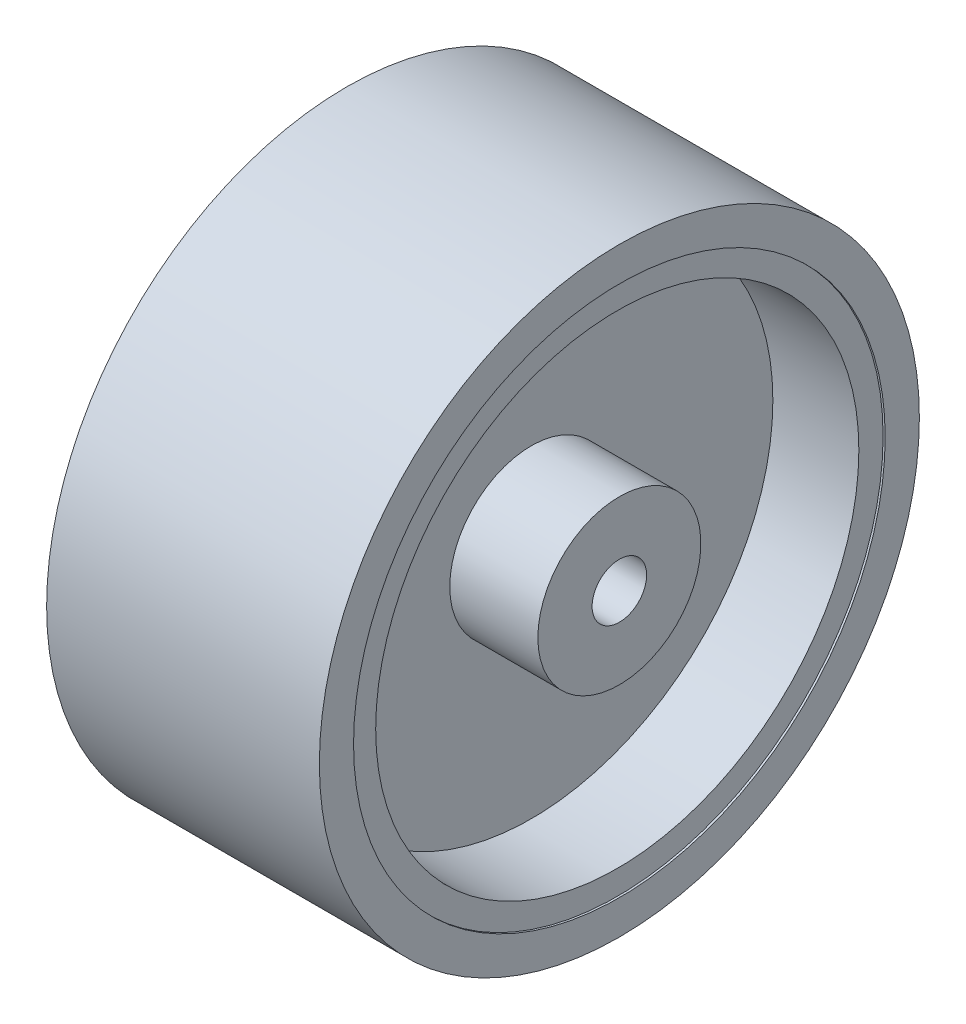
ISO-10303-21;
HEADER;
FILE_DESCRIPTION(('STEP AP214'),'2;1');
FILE_NAME('part.step','',(''),(''),'','','');
FILE_SCHEMA(('AUTOMOTIVE_DESIGN { 1 0 10303 214 1 1 1 1 }'));
ENDSEC;
DATA;
#1=APPLICATION_CONTEXT('core data for automotive mechanical design processes');
#2=APPLICATION_PROTOCOL_DEFINITION('international standard','automotive_design',2000,#1);
#3=PRODUCT_CONTEXT('',#1,'mechanical');
#4=PRODUCT('Part','Part','',(#3));
#5=PRODUCT_RELATED_PRODUCT_CATEGORY('part','',(#4));
#6=PRODUCT_DEFINITION_FORMATION('','',#4);
#7=PRODUCT_DEFINITION_CONTEXT('part definition',#1,'design');
#8=PRODUCT_DEFINITION('design','',#6,#7);
#9=PRODUCT_DEFINITION_SHAPE('','',#8);
#10=(LENGTH_UNIT() NAMED_UNIT(*) SI_UNIT(.MILLI.,.METRE.));
#11=(NAMED_UNIT(*) PLANE_ANGLE_UNIT() SI_UNIT($,.RADIAN.));
#12=(NAMED_UNIT(*) SI_UNIT($,.STERADIAN.) SOLID_ANGLE_UNIT());
#13=UNCERTAINTY_MEASURE_WITH_UNIT(LENGTH_MEASURE(1.E-05),#10,'distance_accuracy_value','');
#14=(GEOMETRIC_REPRESENTATION_CONTEXT(3) GLOBAL_UNCERTAINTY_ASSIGNED_CONTEXT((#13)) GLOBAL_UNIT_ASSIGNED_CONTEXT((#10,
#11,#12)) REPRESENTATION_CONTEXT('',''));
#15=CARTESIAN_POINT('',(0.,0.,0.));
#16=DIRECTION('',(0.,0.,1.));
#17=DIRECTION('',(1.,0.,0.));
#18=AXIS2_PLACEMENT_3D('',#15,#16,#17);
#19=CARTESIAN_POINT('',(-44.6044873702833,0.,0.));
#20=DIRECTION('',(-1.,0.,0.));
#21=DIRECTION('',(0.,0.,1.));
#22=AXIS2_PLACEMENT_3D('',#19,#20,#21);
#23=CYLINDRICAL_SURFACE('',#22,2.49999999999999);
#24=CARTESIAN_POINT('',(12.5,0.,0.));
#25=DIRECTION('',(-1.,0.,0.));
#26=DIRECTION('',(0.,0.,1.));
#27=AXIS2_PLACEMENT_3D('',#24,#25,#26);
#28=CIRCLE('',#27,2.49999999999999);
#29=CARTESIAN_POINT('',(12.5,0.,2.49999999999999));
#30=VERTEX_POINT('',#29);
#31=EDGE_CURVE('E85',#30,#30,#28,.T.);
#32=ORIENTED_EDGE('',*,*,#31,.F.);
#33=EDGE_LOOP('',(#32));
#34=FACE_BOUND('',#33,.T.);
#35=CARTESIAN_POINT('',(-12.5,0.,0.));
#36=DIRECTION('',(-1.,0.,0.));
#37=DIRECTION('',(0.,0.,1.));
#38=AXIS2_PLACEMENT_3D('',#35,#36,#37);
#39=CIRCLE('',#38,2.49999999999999);
#40=CARTESIAN_POINT('',(-12.5,0.,2.49999999999999));
#41=VERTEX_POINT('',#40);
#42=EDGE_CURVE('E10',#41,#41,#39,.T.);
#43=ORIENTED_EDGE('',*,*,#42,.T.);
#44=EDGE_LOOP('',(#43));
#45=FACE_BOUND('',#44,.T.);
#46=ADVANCED_FACE('F33',(#34,#45),#23,.F.);
#47=CARTESIAN_POINT('',(-12.5,7.47149617375056,0.));
#48=DIRECTION('',(1.,0.,0.));
#49=DIRECTION('',(0.,0.,-1.));
#50=AXIS2_PLACEMENT_3D('',#47,#48,#49);
#51=PLANE('',#50);
#52=ORIENTED_EDGE('',*,*,#42,.F.);
#53=EDGE_LOOP('',(#52));
#54=FACE_BOUND('',#53,.T.);
#55=CARTESIAN_POINT('',(-12.5,0.,0.));
#56=DIRECTION('',(-1.,0.,0.));
#57=DIRECTION('',(0.,0.,1.));
#58=AXIS2_PLACEMENT_3D('',#55,#56,#57);
#59=CIRCLE('',#58,7.47149617375057);
#60=CARTESIAN_POINT('',(-12.5,0.,7.47149617375057));
#61=VERTEX_POINT('',#60);
#62=EDGE_CURVE('E39',#61,#61,#59,.T.);
#63=ORIENTED_EDGE('',*,*,#62,.T.);
#64=EDGE_LOOP('',(#63));
#65=FACE_BOUND('',#64,.T.);
#66=ADVANCED_FACE('F92',(#54,#65),#51,.F.);
#67=CARTESIAN_POINT('',(-44.6044873702833,0.,0.));
#68=DIRECTION('',(-1.,0.,0.));
#69=DIRECTION('',(0.,0.,1.));
#70=AXIS2_PLACEMENT_3D('',#67,#68,#69);
#71=CYLINDRICAL_SURFACE('',#70,7.47149617375057);
#72=ORIENTED_EDGE('',*,*,#62,.F.);
#73=EDGE_LOOP('',(#72));
#74=FACE_BOUND('',#73,.T.);
#75=CARTESIAN_POINT('',(-4.42564817527247,0.,0.));
#76=DIRECTION('',(-1.,0.,0.));
#77=DIRECTION('',(0.,0.,1.));
#78=AXIS2_PLACEMENT_3D('',#75,#76,#77);
#79=CIRCLE('',#78,7.47149617375057);
#80=CARTESIAN_POINT('',(-4.42564817527247,0.,7.47149617375057));
#81=VERTEX_POINT('',#80);
#82=EDGE_CURVE('E43',#81,#81,#79,.T.);
#83=ORIENTED_EDGE('',*,*,#82,.T.);
#84=EDGE_LOOP('',(#83));
#85=FACE_BOUND('',#84,.T.);
#86=ADVANCED_FACE('F96',(#74,#85),#71,.T.);
#87=CARTESIAN_POINT('',(-4.42564817527247,22.1448012654798,0.));
#88=DIRECTION('',(1.,0.,0.));
#89=DIRECTION('',(0.,0.,-1.));
#90=AXIS2_PLACEMENT_3D('',#87,#88,#89);
#91=PLANE('',#90);
#92=ORIENTED_EDGE('',*,*,#82,.F.);
#93=EDGE_LOOP('',(#92));
#94=FACE_BOUND('',#93,.T.);
#95=CARTESIAN_POINT('',(-4.42564817527247,0.,0.));
#96=DIRECTION('',(-1.,0.,0.));
#97=DIRECTION('',(0.,0.,1.));
#98=AXIS2_PLACEMENT_3D('',#95,#96,#97);
#99=CIRCLE('',#98,22.1448012654799);
#100=CARTESIAN_POINT('',(-4.42564817527247,0.,22.1448012654799));
#101=VERTEX_POINT('',#100);
#102=EDGE_CURVE('E47',#101,#101,#99,.T.);
#103=ORIENTED_EDGE('',*,*,#102,.T.);
#104=EDGE_LOOP('',(#103));
#105=FACE_BOUND('',#104,.T.);
#106=ADVANCED_FACE('F101',(#94,#105),#91,.F.);
#107=CARTESIAN_POINT('',(-44.6044873702833,0.,0.));
#108=DIRECTION('',(-1.,0.,0.));
#109=DIRECTION('',(0.,0.,1.));
#110=AXIS2_PLACEMENT_3D('',#107,#108,#109);
#111=CYLINDRICAL_SURFACE('',#110,22.1448012654799);
#112=ORIENTED_EDGE('',*,*,#102,.F.);
#113=EDGE_LOOP('',(#112));
#114=FACE_BOUND('',#113,.T.);
#115=CARTESIAN_POINT('',(-12.3076228249519,0.,0.));
#116=DIRECTION('',(-1.,0.,0.));
#117=DIRECTION('',(0.,0.,1.));
#118=AXIS2_PLACEMENT_3D('',#115,#116,#117);
#119=CIRCLE('',#118,22.1448012654799);
#120=CARTESIAN_POINT('',(-12.3076228249519,0.,22.1448012654799));
#121=VERTEX_POINT('',#120);
#122=EDGE_CURVE('E52',#121,#121,#119,.T.);
#123=ORIENTED_EDGE('',*,*,#122,.T.);
#124=EDGE_LOOP('',(#123));
#125=FACE_BOUND('',#124,.T.);
#126=ADVANCED_FACE('F107',(#114,#125),#111,.F.);
#127=CARTESIAN_POINT('',(-12.3076228249519,24.3662960139807,0.));
#128=DIRECTION('',(1.,0.,0.));
#129=DIRECTION('',(0.,0.,-1.));
#130=AXIS2_PLACEMENT_3D('',#127,#128,#129);
#131=PLANE('',#130);
#132=ORIENTED_EDGE('',*,*,#122,.F.);
#133=EDGE_LOOP('',(#132));
#134=FACE_BOUND('',#133,.T.);
#135=CARTESIAN_POINT('',(-12.3076228249519,0.,0.));
#136=DIRECTION('',(-1.,0.,0.));
#137=DIRECTION('',(0.,0.,1.));
#138=AXIS2_PLACEMENT_3D('',#135,#136,#137);
#139=CIRCLE('',#138,24.3662960139807);
#140=CARTESIAN_POINT('',(-12.3076228249519,0.,24.3662960139807));
#141=VERTEX_POINT('',#140);
#142=EDGE_CURVE('E55',#141,#141,#139,.T.);
#143=ORIENTED_EDGE('',*,*,#142,.T.);
#144=EDGE_LOOP('',(#143));
#145=FACE_BOUND('',#144,.T.);
#146=ADVANCED_FACE('F111',(#134,#145),#131,.F.);
#147=CARTESIAN_POINT('',(-44.6044873702833,0.,0.));
#148=DIRECTION('',(-1.,0.,0.));
#149=DIRECTION('',(0.,0.,1.));
#150=AXIS2_PLACEMENT_3D('',#147,#148,#149);
#151=CYLINDRICAL_SURFACE('',#150,24.3662960139807);
#152=ORIENTED_EDGE('',*,*,#142,.F.);
#153=EDGE_LOOP('',(#152));
#154=FACE_BOUND('',#153,.T.);
#155=CARTESIAN_POINT('',(-12.5,0.,0.));
#156=DIRECTION('',(-1.,0.,0.));
#157=DIRECTION('',(0.,0.,1.));
#158=AXIS2_PLACEMENT_3D('',#155,#156,#157);
#159=CIRCLE('',#158,24.3662960139807);
#160=CARTESIAN_POINT('',(-12.5,0.,24.3662960139807));
#161=VERTEX_POINT('',#160);
#162=EDGE_CURVE('E58',#161,#161,#159,.T.);
#163=ORIENTED_EDGE('',*,*,#162,.T.);
#164=EDGE_LOOP('',(#163));
#165=FACE_BOUND('',#164,.T.);
#166=ADVANCED_FACE('F115',(#154,#165),#151,.F.);
#167=CARTESIAN_POINT('',(-12.5,27.5,0.));
#168=DIRECTION('',(1.,0.,0.));
#169=DIRECTION('',(0.,0.,-1.));
#170=AXIS2_PLACEMENT_3D('',#167,#168,#169);
#171=PLANE('',#170);
#172=ORIENTED_EDGE('',*,*,#162,.F.);
#173=EDGE_LOOP('',(#172));
#174=FACE_BOUND('',#173,.T.);
#175=CARTESIAN_POINT('',(-12.5,0.,0.));
#176=DIRECTION('',(-1.,0.,0.));
#177=DIRECTION('',(0.,0.,1.));
#178=AXIS2_PLACEMENT_3D('',#175,#176,#177);
#179=CIRCLE('',#178,27.5);
#180=CARTESIAN_POINT('',(-12.5,0.,27.5));
#181=VERTEX_POINT('',#180);
#182=EDGE_CURVE('E61',#181,#181,#179,.T.);
#183=ORIENTED_EDGE('',*,*,#182,.T.);
#184=EDGE_LOOP('',(#183));
#185=FACE_BOUND('',#184,.T.);
#186=ADVANCED_FACE('F119',(#174,#185),#171,.F.);
#187=CARTESIAN_POINT('',(-44.6044873702833,0.,0.));
#188=DIRECTION('',(-1.,0.,0.));
#189=DIRECTION('',(0.,0.,1.));
#190=AXIS2_PLACEMENT_3D('',#187,#188,#189);
#191=CYLINDRICAL_SURFACE('',#190,27.5);
#192=ORIENTED_EDGE('',*,*,#182,.F.);
#193=EDGE_LOOP('',(#192));
#194=FACE_BOUND('',#193,.T.);
#195=CARTESIAN_POINT('',(12.5,0.,0.));
#196=DIRECTION('',(-1.,0.,0.));
#197=DIRECTION('',(0.,0.,1.));
#198=AXIS2_PLACEMENT_3D('',#195,#196,#197);
#199=CIRCLE('',#198,27.5);
#200=CARTESIAN_POINT('',(12.5,0.,27.5));
#201=VERTEX_POINT('',#200);
#202=EDGE_CURVE('E64',#201,#201,#199,.T.);
#203=ORIENTED_EDGE('',*,*,#202,.T.);
#204=EDGE_LOOP('',(#203));
#205=FACE_BOUND('',#204,.T.);
#206=ADVANCED_FACE('F123',(#194,#205),#191,.T.);
#207=CARTESIAN_POINT('',(12.5,27.5,0.));
#208=DIRECTION('',(-1.,0.,0.));
#209=DIRECTION('',(0.,0.,1.));
#210=AXIS2_PLACEMENT_3D('',#207,#208,#209);
#211=PLANE('',#210);
#212=ORIENTED_EDGE('',*,*,#202,.F.);
#213=EDGE_LOOP('',(#212));
#214=FACE_BOUND('',#213,.T.);
#215=CARTESIAN_POINT('',(12.5,0.,0.));
#216=DIRECTION('',(-1.,0.,0.));
#217=DIRECTION('',(0.,0.,1.));
#218=AXIS2_PLACEMENT_3D('',#215,#216,#217);
#219=CIRCLE('',#218,24.3662960139807);
#220=CARTESIAN_POINT('',(12.5,0.,24.3662960139807));
#221=VERTEX_POINT('',#220);
#222=EDGE_CURVE('E67',#221,#221,#219,.T.);
#223=ORIENTED_EDGE('',*,*,#222,.T.);
#224=EDGE_LOOP('',(#223));
#225=FACE_BOUND('',#224,.T.);
#226=ADVANCED_FACE('F127',(#214,#225),#211,.F.);
#227=CARTESIAN_POINT('',(-44.6044873702833,0.,0.));
#228=DIRECTION('',(-1.,0.,0.));
#229=DIRECTION('',(0.,0.,1.));
#230=AXIS2_PLACEMENT_3D('',#227,#228,#229);
#231=CYLINDRICAL_SURFACE('',#230,24.3662960139807);
#232=ORIENTED_EDGE('',*,*,#222,.F.);
#233=EDGE_LOOP('',(#232));
#234=FACE_BOUND('',#233,.T.);
#235=CARTESIAN_POINT('',(12.3076228249519,0.,0.));
#236=DIRECTION('',(-1.,0.,0.));
#237=DIRECTION('',(0.,0.,1.));
#238=AXIS2_PLACEMENT_3D('',#235,#236,#237);
#239=CIRCLE('',#238,24.3662960139807);
#240=CARTESIAN_POINT('',(12.3076228249519,0.,24.3662960139807));
#241=VERTEX_POINT('',#240);
#242=EDGE_CURVE('E70',#241,#241,#239,.T.);
#243=ORIENTED_EDGE('',*,*,#242,.T.);
#244=EDGE_LOOP('',(#243));
#245=FACE_BOUND('',#244,.T.);
#246=ADVANCED_FACE('F131',(#234,#245),#231,.F.);
#247=CARTESIAN_POINT('',(12.3076228249519,24.3662960139807,0.));
#248=DIRECTION('',(-1.,0.,0.));
#249=DIRECTION('',(0.,0.,1.));
#250=AXIS2_PLACEMENT_3D('',#247,#248,#249);
#251=PLANE('',#250);
#252=ORIENTED_EDGE('',*,*,#242,.F.);
#253=EDGE_LOOP('',(#252));
#254=FACE_BOUND('',#253,.T.);
#255=CARTESIAN_POINT('',(12.3076228249519,0.,0.));
#256=DIRECTION('',(-1.,0.,0.));
#257=DIRECTION('',(0.,0.,1.));
#258=AXIS2_PLACEMENT_3D('',#255,#256,#257);
#259=CIRCLE('',#258,22.1448012654799);
#260=CARTESIAN_POINT('',(12.3076228249519,0.,22.1448012654799));
#261=VERTEX_POINT('',#260);
#262=EDGE_CURVE('E73',#261,#261,#259,.T.);
#263=ORIENTED_EDGE('',*,*,#262,.T.);
#264=EDGE_LOOP('',(#263));
#265=FACE_BOUND('',#264,.T.);
#266=ADVANCED_FACE('F135',(#254,#265),#251,.F.);
#267=CARTESIAN_POINT('',(-44.6044873702833,0.,0.));
#268=DIRECTION('',(-1.,0.,0.));
#269=DIRECTION('',(0.,0.,1.));
#270=AXIS2_PLACEMENT_3D('',#267,#268,#269);
#271=CYLINDRICAL_SURFACE('',#270,22.1448012654799);
#272=ORIENTED_EDGE('',*,*,#262,.F.);
#273=EDGE_LOOP('',(#272));
#274=FACE_BOUND('',#273,.T.);
#275=CARTESIAN_POINT('',(4.42564817527247,0.,0.));
#276=DIRECTION('',(-1.,0.,0.));
#277=DIRECTION('',(0.,0.,1.));
#278=AXIS2_PLACEMENT_3D('',#275,#276,#277);
#279=CIRCLE('',#278,22.1448012654799);
#280=CARTESIAN_POINT('',(4.42564817527247,0.,22.1448012654799));
#281=VERTEX_POINT('',#280);
#282=EDGE_CURVE('E76',#281,#281,#279,.T.);
#283=ORIENTED_EDGE('',*,*,#282,.T.);
#284=EDGE_LOOP('',(#283));
#285=FACE_BOUND('',#284,.T.);
#286=ADVANCED_FACE('F139',(#274,#285),#271,.F.);
#287=CARTESIAN_POINT('',(4.42564817527247,22.1448012654799,0.));
#288=DIRECTION('',(-1.,0.,0.));
#289=DIRECTION('',(0.,0.,1.));
#290=AXIS2_PLACEMENT_3D('',#287,#288,#289);
#291=PLANE('',#290);
#292=ORIENTED_EDGE('',*,*,#282,.F.);
#293=EDGE_LOOP('',(#292));
#294=FACE_BOUND('',#293,.T.);
#295=CARTESIAN_POINT('',(4.42564817527247,0.,0.));
#296=DIRECTION('',(-1.,0.,0.));
#297=DIRECTION('',(0.,0.,1.));
#298=AXIS2_PLACEMENT_3D('',#295,#296,#297);
#299=CIRCLE('',#298,7.47149617375057);
#300=CARTESIAN_POINT('',(4.42564817527247,0.,7.47149617375057));
#301=VERTEX_POINT('',#300);
#302=EDGE_CURVE('E79',#301,#301,#299,.T.);
#303=ORIENTED_EDGE('',*,*,#302,.T.);
#304=EDGE_LOOP('',(#303));
#305=FACE_BOUND('',#304,.T.);
#306=ADVANCED_FACE('F143',(#294,#305),#291,.F.);
#307=CARTESIAN_POINT('',(-44.6044873702833,0.,0.));
#308=DIRECTION('',(-1.,0.,0.));
#309=DIRECTION('',(0.,0.,1.));
#310=AXIS2_PLACEMENT_3D('',#307,#308,#309);
#311=CYLINDRICAL_SURFACE('',#310,7.47149617375057);
#312=ORIENTED_EDGE('',*,*,#302,.F.);
#313=EDGE_LOOP('',(#312));
#314=FACE_BOUND('',#313,.T.);
#315=CARTESIAN_POINT('',(12.5,0.,0.));
#316=DIRECTION('',(-1.,0.,0.));
#317=DIRECTION('',(0.,0.,1.));
#318=AXIS2_PLACEMENT_3D('',#315,#316,#317);
#319=CIRCLE('',#318,7.47149617375057);
#320=CARTESIAN_POINT('',(12.5,0.,7.47149617375057));
#321=VERTEX_POINT('',#320);
#322=EDGE_CURVE('E82',#321,#321,#319,.T.);
#323=ORIENTED_EDGE('',*,*,#322,.T.);
#324=EDGE_LOOP('',(#323));
#325=FACE_BOUND('',#324,.T.);
#326=ADVANCED_FACE('F147',(#314,#325),#311,.T.);
#327=CARTESIAN_POINT('',(12.5,7.47149617375056,0.));
#328=DIRECTION('',(-1.,0.,0.));
#329=DIRECTION('',(0.,0.,1.));
#330=AXIS2_PLACEMENT_3D('',#327,#328,#329);
#331=PLANE('',#330);
#332=ORIENTED_EDGE('',*,*,#322,.F.);
#333=EDGE_LOOP('',(#332));
#334=FACE_BOUND('',#333,.T.);
#335=ORIENTED_EDGE('',*,*,#31,.T.);
#336=EDGE_LOOP('',(#335));
#337=FACE_BOUND('',#336,.T.);
#338=ADVANCED_FACE('F89',(#334,#337),#331,.F.);
#339=CLOSED_SHELL('',(#46,#66,#86,#106,#126,#146,#166,#186,#206,#226,#246,#266,#286,#306,#326,#338));
#340=MANIFOLD_SOLID_BREP('B2',#339);
#341=ADVANCED_BREP_SHAPE_REPRESENTATION('',(#18,#340),#14);
#342=SHAPE_DEFINITION_REPRESENTATION(#9,#341);
ENDSEC;
END-ISO-10303-21;
